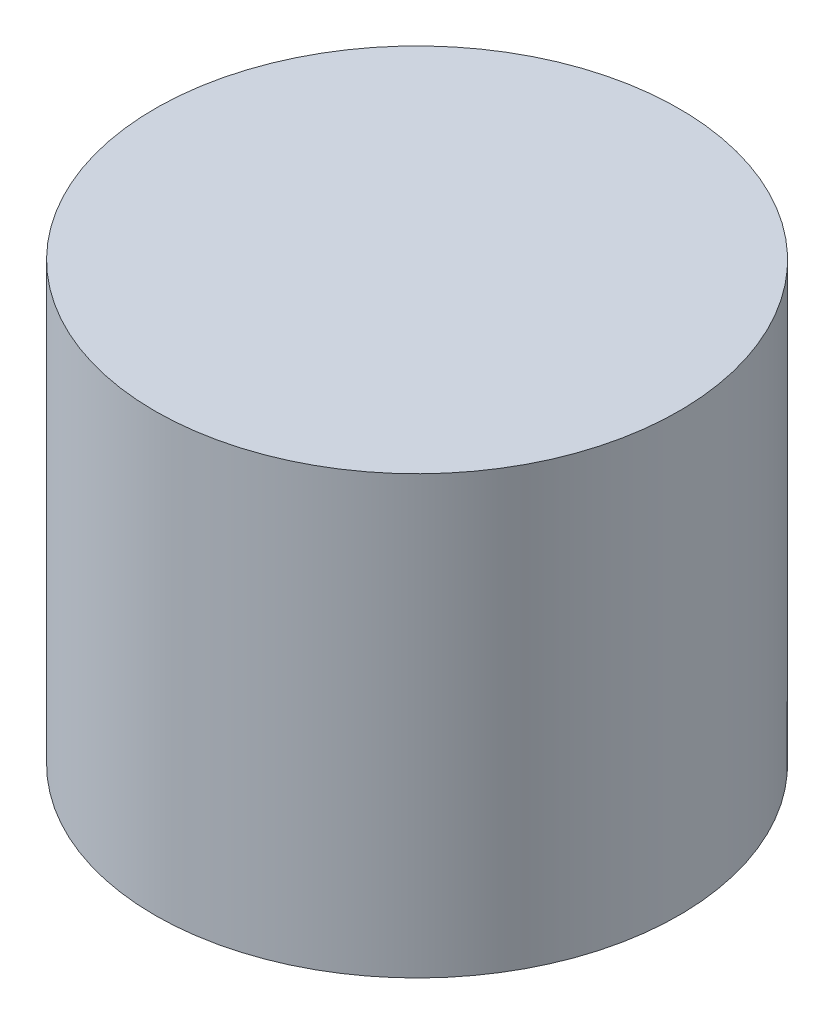
ISO-10303-21;
HEADER;
FILE_DESCRIPTION(('STEP AP214'),'2;1');
FILE_NAME('part.step','',(''),(''),'','','');
FILE_SCHEMA(('AUTOMOTIVE_DESIGN { 1 0 10303 214 1 1 1 1 }'));
ENDSEC;
DATA;
#1=APPLICATION_CONTEXT('core data for automotive mechanical design processes');
#2=APPLICATION_PROTOCOL_DEFINITION('international standard','automotive_design',2000,#1);
#3=PRODUCT_CONTEXT('',#1,'mechanical');
#4=PRODUCT('Part','Part','',(#3));
#5=PRODUCT_RELATED_PRODUCT_CATEGORY('part','',(#4));
#6=PRODUCT_DEFINITION_FORMATION('','',#4);
#7=PRODUCT_DEFINITION_CONTEXT('part definition',#1,'design');
#8=PRODUCT_DEFINITION('design','',#6,#7);
#9=PRODUCT_DEFINITION_SHAPE('','',#8);
#10=(LENGTH_UNIT() NAMED_UNIT(*) SI_UNIT(.MILLI.,.METRE.));
#11=(NAMED_UNIT(*) PLANE_ANGLE_UNIT() SI_UNIT($,.RADIAN.));
#12=(NAMED_UNIT(*) SI_UNIT($,.STERADIAN.) SOLID_ANGLE_UNIT());
#13=UNCERTAINTY_MEASURE_WITH_UNIT(LENGTH_MEASURE(1.E-05),#10,'distance_accuracy_value','');
#14=(GEOMETRIC_REPRESENTATION_CONTEXT(3) GLOBAL_UNCERTAINTY_ASSIGNED_CONTEXT((#13)) GLOBAL_UNIT_ASSIGNED_CONTEXT((#10,
#11,#12)) REPRESENTATION_CONTEXT('',''));
#15=CARTESIAN_POINT('',(0.,0.,0.));
#16=DIRECTION('',(0.,0.,1.));
#17=DIRECTION('',(1.,0.,0.));
#18=AXIS2_PLACEMENT_3D('',#15,#16,#17);
#19=CARTESIAN_POINT('',(12.5,25.,12.5));
#20=DIRECTION('',(0.,-1.,0.));
#21=DIRECTION('',(0.,0.,-1.));
#22=AXIS2_PLACEMENT_3D('',#19,#20,#21);
#23=CYLINDRICAL_SURFACE('',#22,15.);
#24=CARTESIAN_POINT('',(12.5,25.,12.5));
#25=DIRECTION('',(0.,1.,0.));
#26=DIRECTION('',(0.,0.,1.));
#27=AXIS2_PLACEMENT_3D('',#24,#25,#26);
#28=CIRCLE('',#27,15.);
#29=CARTESIAN_POINT('',(12.5,25.,27.5));
#30=VERTEX_POINT('',#29);
#31=EDGE_CURVE('E10',#30,#30,#28,.T.);
#32=ORIENTED_EDGE('',*,*,#31,.F.);
#33=EDGE_LOOP('',(#32));
#34=FACE_BOUND('',#33,.T.);
#35=CARTESIAN_POINT('',(12.5,0.,12.5));
#36=DIRECTION('',(0.,1.,0.));
#37=DIRECTION('',(0.,0.,1.));
#38=AXIS2_PLACEMENT_3D('',#35,#36,#37);
#39=CIRCLE('',#38,15.);
#40=CARTESIAN_POINT('',(12.5,0.,27.5));
#41=VERTEX_POINT('',#40);
#42=EDGE_CURVE('E40',#41,#41,#39,.T.);
#43=ORIENTED_EDGE('',*,*,#42,.T.);
#44=EDGE_LOOP('',(#43));
#45=FACE_BOUND('',#44,.T.);
#46=ADVANCED_FACE('F37',(#34,#45),#23,.T.);
#47=CARTESIAN_POINT('',(12.5,25.,12.5));
#48=DIRECTION('',(0.,1.,0.));
#49=DIRECTION('',(0.,0.,1.));
#50=AXIS2_PLACEMENT_3D('',#47,#48,#49);
#51=PLANE('',#50);
#52=ORIENTED_EDGE('',*,*,#31,.T.);
#53=EDGE_LOOP('',(#52));
#54=FACE_BOUND('',#53,.T.);
#55=ADVANCED_FACE('F54',(#54),#51,.T.);
#56=CARTESIAN_POINT('',(12.5,0.,12.5));
#57=DIRECTION('',(0.,1.,0.));
#58=DIRECTION('',(0.,0.,1.));
#59=AXIS2_PLACEMENT_3D('',#56,#57,#58);
#60=PLANE('',#59);
#61=ORIENTED_EDGE('',*,*,#42,.F.);
#62=EDGE_LOOP('',(#61));
#63=FACE_BOUND('',#62,.T.);
#64=ADVANCED_FACE('F52',(#63),#60,.F.);
#65=CLOSED_SHELL('',(#46,#55,#64));
#66=MANIFOLD_SOLID_BREP('B2',#65);
#67=ADVANCED_BREP_SHAPE_REPRESENTATION('',(#18,#66),#14);
#68=SHAPE_DEFINITION_REPRESENTATION(#9,#67);
ENDSEC;
END-ISO-10303-21;
